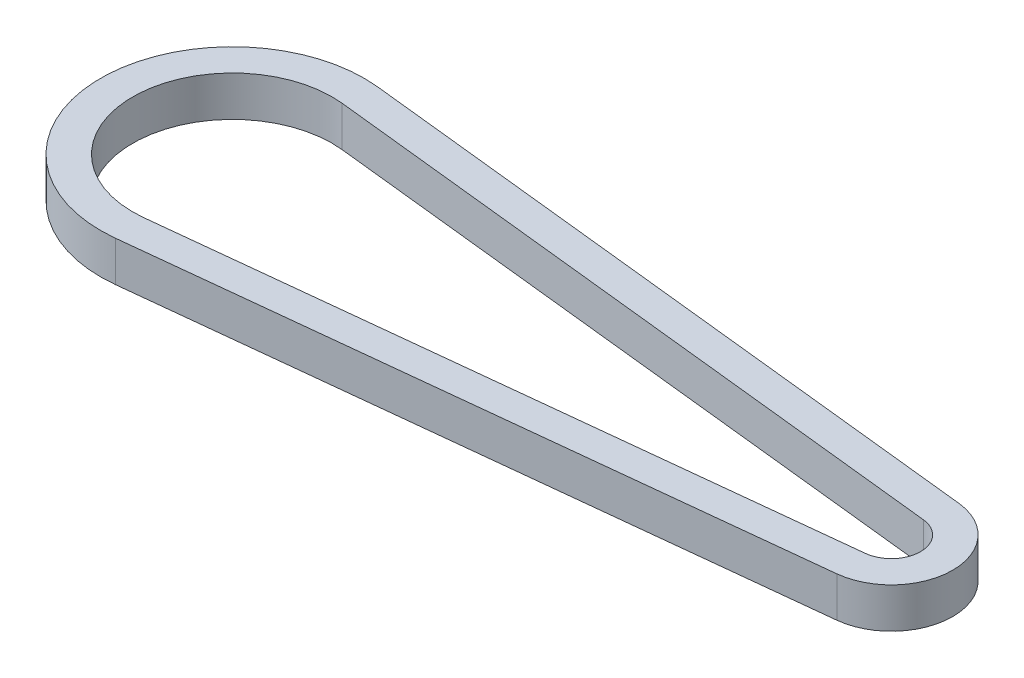
ISO-10303-21;
HEADER;
FILE_DESCRIPTION(('STEP AP214'),'2;1');
FILE_NAME('part.step','',(''),(''),'','','');
FILE_SCHEMA(('AUTOMOTIVE_DESIGN { 1 0 10303 214 1 1 1 1 }'));
ENDSEC;
DATA;
#1=APPLICATION_CONTEXT('core data for automotive mechanical design processes');
#2=APPLICATION_PROTOCOL_DEFINITION('international standard','automotive_design',2000,#1);
#3=PRODUCT_CONTEXT('',#1,'mechanical');
#4=PRODUCT('Part','Part','',(#3));
#5=PRODUCT_RELATED_PRODUCT_CATEGORY('part','',(#4));
#6=PRODUCT_DEFINITION_FORMATION('','',#4);
#7=PRODUCT_DEFINITION_CONTEXT('part definition',#1,'design');
#8=PRODUCT_DEFINITION('design','',#6,#7);
#9=PRODUCT_DEFINITION_SHAPE('','',#8);
#10=(LENGTH_UNIT() NAMED_UNIT(*) SI_UNIT(.MILLI.,.METRE.));
#11=(NAMED_UNIT(*) PLANE_ANGLE_UNIT() SI_UNIT($,.RADIAN.));
#12=(NAMED_UNIT(*) SI_UNIT($,.STERADIAN.) SOLID_ANGLE_UNIT());
#13=UNCERTAINTY_MEASURE_WITH_UNIT(LENGTH_MEASURE(1.E-05),#10,'distance_accuracy_value','');
#14=(GEOMETRIC_REPRESENTATION_CONTEXT(3) GLOBAL_UNCERTAINTY_ASSIGNED_CONTEXT((#13)) GLOBAL_UNIT_ASSIGNED_CONTEXT((#10,
#11,#12)) REPRESENTATION_CONTEXT('',''));
#15=CARTESIAN_POINT('',(0.,0.,0.));
#16=DIRECTION('',(0.,0.,1.));
#17=DIRECTION('',(1.,0.,0.));
#18=AXIS2_PLACEMENT_3D('',#15,#16,#17);
#19=CARTESIAN_POINT('',(204.9,12.5,0.));
#20=DIRECTION('',(0.,1.,0.));
#21=DIRECTION('',(0.,0.,1.));
#22=AXIS2_PLACEMENT_3D('',#19,#20,#21);
#23=PLANE('',#22);
#24=CARTESIAN_POINT('',(204.9,12.5,0.));
#25=DIRECTION('',(0.,1.,0.));
#26=DIRECTION('',(1.,0.,0.));
#27=AXIS2_PLACEMENT_3D('',#24,#25,#26);
#28=CIRCLE('',#27,19.0909090909091);
#29=CARTESIAN_POINT('',(206.941310213811,12.5,18.9814610219642));
#30=VERTEX_POINT('',#29);
#31=CARTESIAN_POINT('',(206.941310213811,12.5,-18.9814610219642));
#32=VERTEX_POINT('',#31);
#33=EDGE_CURVE('E162',#30,#32,#28,.T.);
#34=ORIENTED_EDGE('',*,*,#33,.T.);
#35=DIRECTION('',(-0.994267005912409,0.,-0.106925773104397));
#36=VECTOR('',#35,1.);
#37=CARTESIAN_POINT('',(4.38395669728027,12.5,-40.7649472424088));
#38=LINE('',#37,#36);
#39=CARTESIAN_POINT('',(4.38395669728028,12.5,-40.7649472424088));
#40=VERTEX_POINT('',#39);
#41=EDGE_CURVE('E165',#32,#40,#38,.T.);
#42=ORIENTED_EDGE('',*,*,#41,.T.);
#43=CARTESIAN_POINT('',(0.,12.5,0.));
#44=DIRECTION('',(0.,1.,0.));
#45=DIRECTION('',(1.,0.,0.));
#46=AXIS2_PLACEMENT_3D('',#43,#44,#45);
#47=CIRCLE('',#46,41.);
#48=CARTESIAN_POINT('',(4.3839566972803,12.5,40.7649472424088));
#49=VERTEX_POINT('',#48);
#50=EDGE_CURVE('E168',#40,#49,#47,.T.);
#51=ORIENTED_EDGE('',*,*,#50,.T.);
#52=DIRECTION('',(0.994267005912409,0.,-0.106925773104397));
#53=VECTOR('',#52,1.);
#54=CARTESIAN_POINT('',(206.941310213811,12.5,18.9814610219642));
#55=LINE('',#54,#53);
#56=EDGE_CURVE('E170',#49,#30,#55,.T.);
#57=ORIENTED_EDGE('',*,*,#56,.T.);
#58=EDGE_LOOP('',(#34,#42,#51,#57));
#59=FACE_BOUND('',#58,.T.);
#60=DIRECTION('',(-0.994267005912409,0.,-0.106925773104397));
#61=VECTOR('',#60,1.);
#62=CARTESIAN_POINT('',(3.3146989662363,12.5,-30.8222771832847));
#63=LINE('',#62,#61);
#64=CARTESIAN_POINT('',(205.872052482767,12.5,-9.03879096284009));
#65=VERTEX_POINT('',#64);
#66=CARTESIAN_POINT('',(3.31469896623631,12.5,-30.8222771832847));
#67=VERTEX_POINT('',#66);
#68=EDGE_CURVE('E134',#65,#67,#63,.T.);
#69=ORIENTED_EDGE('',*,*,#68,.F.);
#70=CARTESIAN_POINT('',(204.9,12.5,0.));
#71=DIRECTION('',(0.,1.,0.));
#72=DIRECTION('',(0.,0.,1.));
#73=AXIS2_PLACEMENT_3D('',#70,#71,#72);
#74=CIRCLE('',#73,9.09090909090909);
#75=CARTESIAN_POINT('',(205.872052482767,12.5,9.03879096284009));
#76=VERTEX_POINT('',#75);
#77=EDGE_CURVE('E126',#76,#65,#74,.T.);
#78=ORIENTED_EDGE('',*,*,#77,.F.);
#79=DIRECTION('',(0.994267005912409,0.,-0.106925773104397));
#80=VECTOR('',#79,1.);
#81=CARTESIAN_POINT('',(205.872052482767,12.5,9.03879096284009));
#82=LINE('',#81,#80);
#83=CARTESIAN_POINT('',(3.31469896623629,12.5,30.8222771832847));
#84=VERTEX_POINT('',#83);
#85=EDGE_CURVE('E148',#84,#76,#82,.T.);
#86=ORIENTED_EDGE('',*,*,#85,.F.);
#87=CARTESIAN_POINT('',(0.,12.5,0.));
#88=DIRECTION('',(0.,1.,0.));
#89=DIRECTION('',(0.,0.,1.));
#90=AXIS2_PLACEMENT_3D('',#87,#88,#89);
#91=CIRCLE('',#90,31.);
#92=EDGE_CURVE('E146',#67,#84,#91,.T.);
#93=ORIENTED_EDGE('',*,*,#92,.F.);
#94=EDGE_LOOP('',(#69,#78,#86,#93));
#95=FACE_BOUND('',#94,.T.);
#96=ADVANCED_FACE('F61',(#59,#95),#23,.T.);
#97=CARTESIAN_POINT('',(204.9,0.,0.));
#98=DIRECTION('',(0.,1.,0.));
#99=DIRECTION('',(0.,0.,1.));
#100=AXIS2_PLACEMENT_3D('',#97,#98,#99);
#101=PLANE('',#100);
#102=CARTESIAN_POINT('',(204.9,0.,0.));
#103=DIRECTION('',(0.,1.,0.));
#104=DIRECTION('',(1.,0.,0.));
#105=AXIS2_PLACEMENT_3D('',#102,#103,#104);
#106=CIRCLE('',#105,19.0909090909091);
#107=CARTESIAN_POINT('',(206.941310213811,0.,18.9814610219642));
#108=VERTEX_POINT('',#107);
#109=CARTESIAN_POINT('',(206.941310213811,0.,-18.9814610219642));
#110=VERTEX_POINT('',#109);
#111=EDGE_CURVE('E142',#108,#110,#106,.T.);
#112=ORIENTED_EDGE('',*,*,#111,.F.);
#113=DIRECTION('',(0.994267005912409,0.,-0.106925773104397));
#114=VECTOR('',#113,1.);
#115=CARTESIAN_POINT('',(206.941310213811,0.,18.9814610219642));
#116=LINE('',#115,#114);
#117=CARTESIAN_POINT('',(4.3839566972803,0.,40.7649472424088));
#118=VERTEX_POINT('',#117);
#119=EDGE_CURVE('E166',#118,#108,#116,.T.);
#120=ORIENTED_EDGE('',*,*,#119,.F.);
#121=CARTESIAN_POINT('',(0.,0.,0.));
#122=DIRECTION('',(0.,1.,0.));
#123=DIRECTION('',(1.,0.,0.));
#124=AXIS2_PLACEMENT_3D('',#121,#122,#123);
#125=CIRCLE('',#124,41.);
#126=CARTESIAN_POINT('',(4.38395669728028,0.,-40.7649472424088));
#127=VERTEX_POINT('',#126);
#128=EDGE_CURVE('E177',#127,#118,#125,.T.);
#129=ORIENTED_EDGE('',*,*,#128,.F.);
#130=DIRECTION('',(-0.994267005912409,0.,-0.106925773104397));
#131=VECTOR('',#130,1.);
#132=CARTESIAN_POINT('',(4.38395669728027,0.,-40.7649472424088));
#133=LINE('',#132,#131);
#134=EDGE_CURVE('E175',#110,#127,#133,.T.);
#135=ORIENTED_EDGE('',*,*,#134,.F.);
#136=EDGE_LOOP('',(#112,#120,#129,#135));
#137=FACE_BOUND('',#136,.T.);
#138=CARTESIAN_POINT('',(204.9,0.,0.));
#139=DIRECTION('',(0.,1.,0.));
#140=DIRECTION('',(0.,0.,1.));
#141=AXIS2_PLACEMENT_3D('',#138,#139,#140);
#142=CIRCLE('',#141,9.09090909090909);
#143=CARTESIAN_POINT('',(205.872052482767,0.,9.03879096284009));
#144=VERTEX_POINT('',#143);
#145=CARTESIAN_POINT('',(205.872052482767,0.,-9.03879096284009));
#146=VERTEX_POINT('',#145);
#147=EDGE_CURVE('E84',#144,#146,#142,.T.);
#148=ORIENTED_EDGE('',*,*,#147,.T.);
#149=DIRECTION('',(-0.994267005912409,0.,-0.106925773104397));
#150=VECTOR('',#149,1.);
#151=CARTESIAN_POINT('',(3.3146989662363,0.,-30.8222771832847));
#152=LINE('',#151,#150);
#153=CARTESIAN_POINT('',(3.31469896623631,0.,-30.8222771832847));
#154=VERTEX_POINT('',#153);
#155=EDGE_CURVE('E141',#146,#154,#152,.T.);
#156=ORIENTED_EDGE('',*,*,#155,.T.);
#157=CARTESIAN_POINT('',(0.,0.,0.));
#158=DIRECTION('',(0.,1.,0.));
#159=DIRECTION('',(0.,0.,1.));
#160=AXIS2_PLACEMENT_3D('',#157,#158,#159);
#161=CIRCLE('',#160,31.);
#162=CARTESIAN_POINT('',(3.3146989662363,0.,30.8222771832847));
#163=VERTEX_POINT('',#162);
#164=EDGE_CURVE('E154',#154,#163,#161,.T.);
#165=ORIENTED_EDGE('',*,*,#164,.T.);
#166=DIRECTION('',(0.994267005912409,0.,-0.106925773104397));
#167=VECTOR('',#166,1.);
#168=CARTESIAN_POINT('',(205.872052482767,0.,9.03879096284009));
#169=LINE('',#168,#167);
#170=EDGE_CURVE('E135',#163,#144,#169,.T.);
#171=ORIENTED_EDGE('',*,*,#170,.T.);
#172=EDGE_LOOP('',(#148,#156,#165,#171));
#173=FACE_BOUND('',#172,.T.);
#174=ADVANCED_FACE('F195',(#137,#173),#101,.F.);
#175=CARTESIAN_POINT('',(204.9,12.5,0.));
#176=DIRECTION('',(0.,-1.,0.));
#177=DIRECTION('',(0.,0.,-1.));
#178=AXIS2_PLACEMENT_3D('',#175,#176,#177);
#179=CYLINDRICAL_SURFACE('',#178,19.0909090909091);
#180=ORIENTED_EDGE('',*,*,#111,.T.);
#181=DIRECTION('',(0.,-1.,0.));
#182=VECTOR('',#181,1.);
#183=CARTESIAN_POINT('',(206.941310213811,12.5,-18.9814610219642));
#184=LINE('',#183,#182);
#185=EDGE_CURVE('E12',#32,#110,#184,.T.);
#186=ORIENTED_EDGE('',*,*,#185,.F.);
#187=ORIENTED_EDGE('',*,*,#33,.F.);
#188=DIRECTION('',(0.,-1.,0.));
#189=VECTOR('',#188,1.);
#190=CARTESIAN_POINT('',(206.941310213811,12.5,18.9814610219642));
#191=LINE('',#190,#189);
#192=EDGE_CURVE('E172',#30,#108,#191,.T.);
#193=ORIENTED_EDGE('',*,*,#192,.T.);
#194=EDGE_LOOP('',(#180,#186,#187,#193));
#195=FACE_BOUND('',#194,.T.);
#196=ADVANCED_FACE('F63',(#195),#179,.T.);
#197=CARTESIAN_POINT('',(4.38395669728027,12.5,-40.7649472424088));
#198=DIRECTION('',(-0.106925773104397,0.,0.994267005912409));
#199=DIRECTION('',(0.994267005912409,0.,0.106925773104397));
#200=AXIS2_PLACEMENT_3D('',#197,#198,#199);
#201=PLANE('',#200);
#202=ORIENTED_EDGE('',*,*,#134,.T.);
#203=DIRECTION('',(0.,-1.,0.));
#204=VECTOR('',#203,1.);
#205=CARTESIAN_POINT('',(4.38395669728028,12.5,-40.7649472424088));
#206=LINE('',#205,#204);
#207=EDGE_CURVE('E69',#40,#127,#206,.T.);
#208=ORIENTED_EDGE('',*,*,#207,.F.);
#209=ORIENTED_EDGE('',*,*,#41,.F.);
#210=ORIENTED_EDGE('',*,*,#185,.T.);
#211=EDGE_LOOP('',(#202,#208,#209,#210));
#212=FACE_BOUND('',#211,.T.);
#213=ADVANCED_FACE('F205',(#212),#201,.F.);
#214=CARTESIAN_POINT('',(0.,12.5,0.));
#215=DIRECTION('',(0.,-1.,0.));
#216=DIRECTION('',(0.,0.,-1.));
#217=AXIS2_PLACEMENT_3D('',#214,#215,#216);
#218=CYLINDRICAL_SURFACE('',#217,41.);
#219=ORIENTED_EDGE('',*,*,#128,.T.);
#220=DIRECTION('',(0.,-1.,0.));
#221=VECTOR('',#220,1.);
#222=CARTESIAN_POINT('',(4.3839566972803,12.5,40.7649472424088));
#223=LINE('',#222,#221);
#224=EDGE_CURVE('E182',#49,#118,#223,.T.);
#225=ORIENTED_EDGE('',*,*,#224,.F.);
#226=ORIENTED_EDGE('',*,*,#50,.F.);
#227=ORIENTED_EDGE('',*,*,#207,.T.);
#228=EDGE_LOOP('',(#219,#225,#226,#227));
#229=FACE_BOUND('',#228,.T.);
#230=ADVANCED_FACE('F189',(#229),#218,.T.);
#231=CARTESIAN_POINT('',(206.941310213811,12.5,18.9814610219642));
#232=DIRECTION('',(-0.106925773104397,0.,-0.994267005912409));
#233=DIRECTION('',(-0.994267005912409,0.,0.106925773104397));
#234=AXIS2_PLACEMENT_3D('',#231,#232,#233);
#235=PLANE('',#234);
#236=ORIENTED_EDGE('',*,*,#119,.T.);
#237=ORIENTED_EDGE('',*,*,#192,.F.);
#238=ORIENTED_EDGE('',*,*,#56,.F.);
#239=ORIENTED_EDGE('',*,*,#224,.T.);
#240=EDGE_LOOP('',(#236,#237,#238,#239));
#241=FACE_BOUND('',#240,.T.);
#242=ADVANCED_FACE('F199',(#241),#235,.F.);
#243=CARTESIAN_POINT('',(204.9,12.5,0.));
#244=DIRECTION('',(0.,-1.,0.));
#245=DIRECTION('',(0.,0.,-1.));
#246=AXIS2_PLACEMENT_3D('',#243,#244,#245);
#247=CYLINDRICAL_SURFACE('',#246,9.09090909090909);
#248=ORIENTED_EDGE('',*,*,#147,.F.);
#249=DIRECTION('',(0.,-1.,0.));
#250=VECTOR('',#249,1.);
#251=CARTESIAN_POINT('',(205.872052482767,12.5,9.03879096284009));
#252=LINE('',#251,#250);
#253=EDGE_CURVE('E130',#76,#144,#252,.T.);
#254=ORIENTED_EDGE('',*,*,#253,.F.);
#255=ORIENTED_EDGE('',*,*,#77,.T.);
#256=DIRECTION('',(0.,-1.,0.));
#257=VECTOR('',#256,1.);
#258=CARTESIAN_POINT('',(205.872052482767,12.5,-9.03879096284009));
#259=LINE('',#258,#257);
#260=EDGE_CURVE('E129',#65,#146,#259,.T.);
#261=ORIENTED_EDGE('',*,*,#260,.T.);
#262=EDGE_LOOP('',(#248,#254,#255,#261));
#263=FACE_BOUND('',#262,.T.);
#264=ADVANCED_FACE('F128',(#263),#247,.F.);
#265=CARTESIAN_POINT('',(3.3146989662363,12.5,-30.8222771832847));
#266=DIRECTION('',(-0.106925773104397,0.,0.994267005912409));
#267=DIRECTION('',(0.994267005912409,0.,0.106925773104397));
#268=AXIS2_PLACEMENT_3D('',#265,#266,#267);
#269=PLANE('',#268);
#270=ORIENTED_EDGE('',*,*,#155,.F.);
#271=ORIENTED_EDGE('',*,*,#260,.F.);
#272=ORIENTED_EDGE('',*,*,#68,.T.);
#273=DIRECTION('',(0.,-1.,0.));
#274=VECTOR('',#273,1.);
#275=CARTESIAN_POINT('',(3.31469896623631,12.5,-30.8222771832847));
#276=LINE('',#275,#274);
#277=EDGE_CURVE('E143',#67,#154,#276,.T.);
#278=ORIENTED_EDGE('',*,*,#277,.T.);
#279=EDGE_LOOP('',(#270,#271,#272,#278));
#280=FACE_BOUND('',#279,.T.);
#281=ADVANCED_FACE('F138',(#280),#269,.T.);
#282=CARTESIAN_POINT('',(0.,12.5,0.));
#283=DIRECTION('',(0.,-1.,0.));
#284=DIRECTION('',(0.,0.,-1.));
#285=AXIS2_PLACEMENT_3D('',#282,#283,#284);
#286=CYLINDRICAL_SURFACE('',#285,31.);
#287=ORIENTED_EDGE('',*,*,#164,.F.);
#288=ORIENTED_EDGE('',*,*,#277,.F.);
#289=ORIENTED_EDGE('',*,*,#92,.T.);
#290=DIRECTION('',(0.,-1.,0.));
#291=VECTOR('',#290,1.);
#292=CARTESIAN_POINT('',(3.3146989662363,12.5,30.8222771832847));
#293=LINE('',#292,#291);
#294=EDGE_CURVE('E76',#84,#163,#293,.T.);
#295=ORIENTED_EDGE('',*,*,#294,.T.);
#296=EDGE_LOOP('',(#287,#288,#289,#295));
#297=FACE_BOUND('',#296,.T.);
#298=ADVANCED_FACE('F228',(#297),#286,.F.);
#299=CARTESIAN_POINT('',(205.872052482767,12.5,9.03879096284009));
#300=DIRECTION('',(-0.106925773104397,0.,-0.994267005912409));
#301=DIRECTION('',(-0.994267005912409,0.,0.106925773104397));
#302=AXIS2_PLACEMENT_3D('',#299,#300,#301);
#303=PLANE('',#302);
#304=ORIENTED_EDGE('',*,*,#170,.F.);
#305=ORIENTED_EDGE('',*,*,#294,.F.);
#306=ORIENTED_EDGE('',*,*,#85,.T.);
#307=ORIENTED_EDGE('',*,*,#253,.T.);
#308=EDGE_LOOP('',(#304,#305,#306,#307));
#309=FACE_BOUND('',#308,.T.);
#310=ADVANCED_FACE('F232',(#309),#303,.T.);
#311=CLOSED_SHELL('',(#96,#174,#196,#213,#230,#242,#264,#281,#298,#310));
#312=MANIFOLD_SOLID_BREP('B2',#311);
#313=ADVANCED_BREP_SHAPE_REPRESENTATION('',(#18,#312),#14);
#314=SHAPE_DEFINITION_REPRESENTATION(#9,#313);
ENDSEC;
END-ISO-10303-21;
